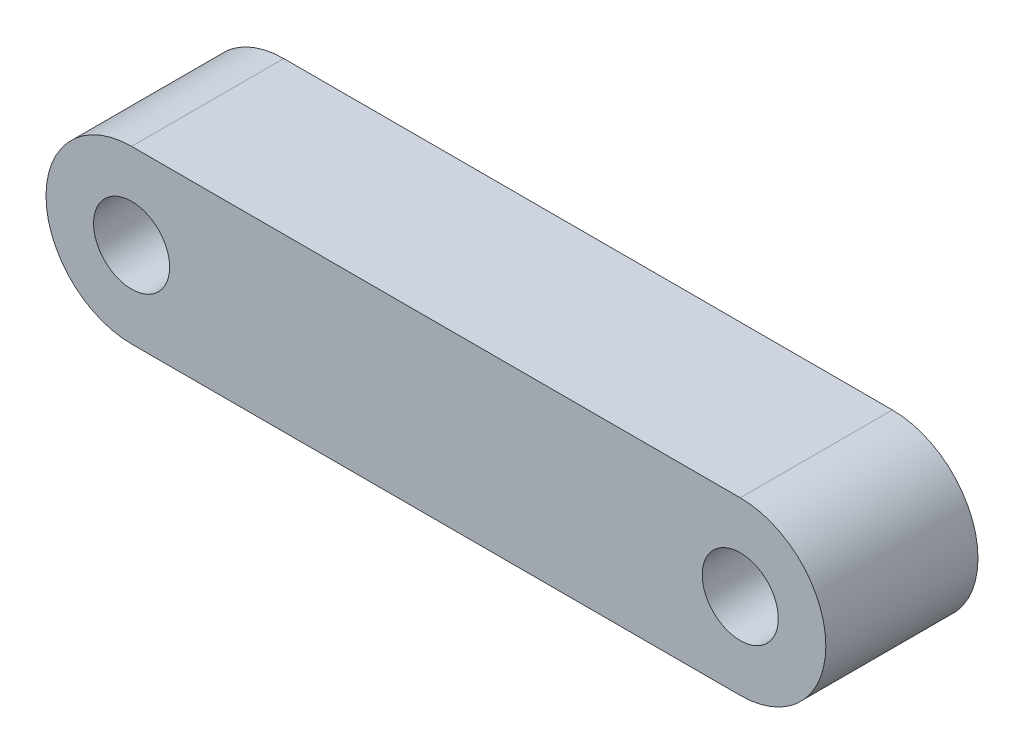
ISO-10303-21;
HEADER;
FILE_DESCRIPTION(('STEP AP214'),'2;1');
FILE_NAME('part.step','',(''),(''),'','','');
FILE_SCHEMA(('AUTOMOTIVE_DESIGN { 1 0 10303 214 1 1 1 1 }'));
ENDSEC;
DATA;
#1=APPLICATION_CONTEXT('core data for automotive mechanical design processes');
#2=APPLICATION_PROTOCOL_DEFINITION('international standard','automotive_design',2000,#1);
#3=PRODUCT_CONTEXT('',#1,'mechanical');
#4=PRODUCT('Part','Part','',(#3));
#5=PRODUCT_RELATED_PRODUCT_CATEGORY('part','',(#4));
#6=PRODUCT_DEFINITION_FORMATION('','',#4);
#7=PRODUCT_DEFINITION_CONTEXT('part definition',#1,'design');
#8=PRODUCT_DEFINITION('design','',#6,#7);
#9=PRODUCT_DEFINITION_SHAPE('','',#8);
#10=(LENGTH_UNIT() NAMED_UNIT(*) SI_UNIT(.MILLI.,.METRE.));
#11=(NAMED_UNIT(*) PLANE_ANGLE_UNIT() SI_UNIT($,.RADIAN.));
#12=(NAMED_UNIT(*) SI_UNIT($,.STERADIAN.) SOLID_ANGLE_UNIT());
#13=UNCERTAINTY_MEASURE_WITH_UNIT(LENGTH_MEASURE(1.E-05),#10,'distance_accuracy_value','');
#14=(GEOMETRIC_REPRESENTATION_CONTEXT(3) GLOBAL_UNCERTAINTY_ASSIGNED_CONTEXT((#13)) GLOBAL_UNIT_ASSIGNED_CONTEXT((#10,
#11,#12)) REPRESENTATION_CONTEXT('',''));
#15=CARTESIAN_POINT('',(0.,0.,0.));
#16=DIRECTION('',(0.,0.,1.));
#17=DIRECTION('',(1.,0.,0.));
#18=AXIS2_PLACEMENT_3D('',#15,#16,#17);
#19=CARTESIAN_POINT('',(0.,0.,8.));
#20=DIRECTION('',(0.,1.,0.));
#21=DIRECTION('',(0.,0.,1.));
#22=AXIS2_PLACEMENT_3D('',#19,#20,#21);
#23=PLANE('',#22);
#24=DIRECTION('',(1.,0.,0.));
#25=VECTOR('',#24,1.);
#26=CARTESIAN_POINT('',(0.,0.,0.));
#27=LINE('',#26,#25);
#28=CARTESIAN_POINT('',(0.,0.,0.));
#29=VERTEX_POINT('',#28);
#30=CARTESIAN_POINT('',(32.,0.,0.));
#31=VERTEX_POINT('',#30);
#32=EDGE_CURVE('E60',#29,#31,#27,.T.);
#33=ORIENTED_EDGE('',*,*,#32,.T.);
#34=DIRECTION('',(0.,0.,-1.));
#35=VECTOR('',#34,1.);
#36=CARTESIAN_POINT('',(32.,0.,8.));
#37=LINE('',#36,#35);
#38=CARTESIAN_POINT('',(32.,0.,8.));
#39=VERTEX_POINT('',#38);
#40=EDGE_CURVE('E41',#39,#31,#37,.T.);
#41=ORIENTED_EDGE('',*,*,#40,.F.);
#42=DIRECTION('',(1.,0.,0.));
#43=VECTOR('',#42,1.);
#44=CARTESIAN_POINT('',(0.,0.,8.));
#45=LINE('',#44,#43);
#46=CARTESIAN_POINT('',(0.,0.,8.));
#47=VERTEX_POINT('',#46);
#48=EDGE_CURVE('E72',#47,#39,#45,.T.);
#49=ORIENTED_EDGE('',*,*,#48,.F.);
#50=DIRECTION('',(0.,0.,-1.));
#51=VECTOR('',#50,1.);
#52=CARTESIAN_POINT('',(0.,0.,8.));
#53=LINE('',#52,#51);
#54=EDGE_CURVE('E11',#47,#29,#53,.T.);
#55=ORIENTED_EDGE('',*,*,#54,.T.);
#56=EDGE_LOOP('',(#33,#41,#49,#55));
#57=FACE_BOUND('',#56,.T.);
#58=ADVANCED_FACE('F33',(#57),#23,.F.);
#59=CARTESIAN_POINT('',(0.,9.,8.));
#60=DIRECTION('',(0.,-1.,0.));
#61=DIRECTION('',(0.,0.,-1.));
#62=AXIS2_PLACEMENT_3D('',#59,#60,#61);
#63=PLANE('',#62);
#64=DIRECTION('',(-1.,0.,0.));
#65=VECTOR('',#64,1.);
#66=CARTESIAN_POINT('',(0.,9.,0.));
#67=LINE('',#66,#65);
#68=CARTESIAN_POINT('',(32.,9.,0.));
#69=VERTEX_POINT('',#68);
#70=CARTESIAN_POINT('',(0.,9.,0.));
#71=VERTEX_POINT('',#70);
#72=EDGE_CURVE('E78',#69,#71,#67,.T.);
#73=ORIENTED_EDGE('',*,*,#72,.T.);
#74=DIRECTION('',(0.,0.,-1.));
#75=VECTOR('',#74,1.);
#76=CARTESIAN_POINT('',(0.,9.,8.));
#77=LINE('',#76,#75);
#78=CARTESIAN_POINT('',(0.,9.,8.));
#79=VERTEX_POINT('',#78);
#80=EDGE_CURVE('E101',#79,#71,#77,.T.);
#81=ORIENTED_EDGE('',*,*,#80,.F.);
#82=DIRECTION('',(-1.,0.,0.));
#83=VECTOR('',#82,1.);
#84=CARTESIAN_POINT('',(0.,9.,8.));
#85=LINE('',#84,#83);
#86=CARTESIAN_POINT('',(32.,9.,8.));
#87=VERTEX_POINT('',#86);
#88=EDGE_CURVE('E49',#87,#79,#85,.T.);
#89=ORIENTED_EDGE('',*,*,#88,.F.);
#90=DIRECTION('',(0.,0.,-1.));
#91=VECTOR('',#90,1.);
#92=CARTESIAN_POINT('',(32.,9.,8.));
#93=LINE('',#92,#91);
#94=EDGE_CURVE('E83',#87,#69,#93,.T.);
#95=ORIENTED_EDGE('',*,*,#94,.T.);
#96=EDGE_LOOP('',(#73,#81,#89,#95));
#97=FACE_BOUND('',#96,.T.);
#98=ADVANCED_FACE('F107',(#97),#63,.F.);
#99=CARTESIAN_POINT('',(0.,0.,8.));
#100=DIRECTION('',(0.,0.,-1.));
#101=DIRECTION('',(-1.,0.,0.));
#102=AXIS2_PLACEMENT_3D('',#99,#100,#101);
#103=PLANE('',#102);
#104=CARTESIAN_POINT('',(0.,4.5,8.));
#105=DIRECTION('',(0.,0.,1.));
#106=DIRECTION('',(1.,0.,0.));
#107=AXIS2_PLACEMENT_3D('',#104,#105,#106);
#108=CIRCLE('',#107,2.);
#109=CARTESIAN_POINT('',(2.,4.5,8.));
#110=VERTEX_POINT('',#109);
#111=EDGE_CURVE('E137',#110,#110,#108,.T.);
#112=ORIENTED_EDGE('',*,*,#111,.F.);
#113=EDGE_LOOP('',(#112));
#114=FACE_BOUND('',#113,.T.);
#115=CARTESIAN_POINT('',(32.,4.5,8.));
#116=DIRECTION('',(0.,0.,1.));
#117=DIRECTION('',(1.,0.,0.));
#118=AXIS2_PLACEMENT_3D('',#115,#116,#117);
#119=CIRCLE('',#118,2.);
#120=CARTESIAN_POINT('',(34.,4.5,8.));
#121=VERTEX_POINT('',#120);
#122=EDGE_CURVE('E92',#121,#121,#119,.T.);
#123=ORIENTED_EDGE('',*,*,#122,.F.);
#124=EDGE_LOOP('',(#123));
#125=FACE_BOUND('',#124,.T.);
#126=ORIENTED_EDGE('',*,*,#88,.T.);
#127=CARTESIAN_POINT('',(0.,4.5,8.));
#128=DIRECTION('',(0.,0.,1.));
#129=DIRECTION('',(1.,0.,0.));
#130=AXIS2_PLACEMENT_3D('',#127,#128,#129);
#131=CIRCLE('',#130,4.5);
#132=EDGE_CURVE('E77',#79,#47,#131,.T.);
#133=ORIENTED_EDGE('',*,*,#132,.T.);
#134=ORIENTED_EDGE('',*,*,#48,.T.);
#135=CARTESIAN_POINT('',(32.,4.5,8.));
#136=DIRECTION('',(0.,0.,1.));
#137=DIRECTION('',(-1.,0.,0.));
#138=AXIS2_PLACEMENT_3D('',#135,#136,#137);
#139=CIRCLE('',#138,4.5);
#140=EDGE_CURVE('E75',#39,#87,#139,.T.);
#141=ORIENTED_EDGE('',*,*,#140,.T.);
#142=EDGE_LOOP('',(#126,#133,#134,#141));
#143=FACE_BOUND('',#142,.T.);
#144=ADVANCED_FACE('F73',(#114,#125,#143),#103,.F.);
#145=CARTESIAN_POINT('',(0.,0.,0.));
#146=DIRECTION('',(0.,0.,-1.));
#147=DIRECTION('',(-1.,0.,0.));
#148=AXIS2_PLACEMENT_3D('',#145,#146,#147);
#149=PLANE('',#148);
#150=CARTESIAN_POINT('',(0.,4.5,0.));
#151=DIRECTION('',(0.,0.,1.));
#152=DIRECTION('',(1.,0.,0.));
#153=AXIS2_PLACEMENT_3D('',#150,#151,#152);
#154=CIRCLE('',#153,2.);
#155=CARTESIAN_POINT('',(2.,4.5,0.));
#156=VERTEX_POINT('',#155);
#157=EDGE_CURVE('E141',#156,#156,#154,.T.);
#158=ORIENTED_EDGE('',*,*,#157,.T.);
#159=EDGE_LOOP('',(#158));
#160=FACE_BOUND('',#159,.T.);
#161=CARTESIAN_POINT('',(32.,4.5,0.));
#162=DIRECTION('',(0.,0.,1.));
#163=DIRECTION('',(1.,0.,0.));
#164=AXIS2_PLACEMENT_3D('',#161,#162,#163);
#165=CIRCLE('',#164,2.);
#166=CARTESIAN_POINT('',(34.,4.5,0.));
#167=VERTEX_POINT('',#166);
#168=EDGE_CURVE('E88',#167,#167,#165,.T.);
#169=ORIENTED_EDGE('',*,*,#168,.T.);
#170=EDGE_LOOP('',(#169));
#171=FACE_BOUND('',#170,.T.);
#172=ORIENTED_EDGE('',*,*,#32,.F.);
#173=CARTESIAN_POINT('',(0.,4.5,0.));
#174=DIRECTION('',(0.,0.,1.));
#175=DIRECTION('',(1.,0.,0.));
#176=AXIS2_PLACEMENT_3D('',#173,#174,#175);
#177=CIRCLE('',#176,4.5);
#178=EDGE_CURVE('E96',#71,#29,#177,.T.);
#179=ORIENTED_EDGE('',*,*,#178,.F.);
#180=ORIENTED_EDGE('',*,*,#72,.F.);
#181=CARTESIAN_POINT('',(32.,4.5,0.));
#182=DIRECTION('',(0.,0.,1.));
#183=DIRECTION('',(-1.,0.,0.));
#184=AXIS2_PLACEMENT_3D('',#181,#182,#183);
#185=CIRCLE('',#184,4.5);
#186=EDGE_CURVE('E87',#31,#69,#185,.T.);
#187=ORIENTED_EDGE('',*,*,#186,.F.);
#188=EDGE_LOOP('',(#172,#179,#180,#187));
#189=FACE_BOUND('',#188,.T.);
#190=ADVANCED_FACE('F109',(#160,#171,#189),#149,.T.);
#191=CARTESIAN_POINT('',(0.,4.5,0.));
#192=DIRECTION('',(0.,0.,1.));
#193=DIRECTION('',(1.,0.,0.));
#194=AXIS2_PLACEMENT_3D('',#191,#192,#193);
#195=CYLINDRICAL_SURFACE('',#194,4.5);
#196=ORIENTED_EDGE('',*,*,#132,.F.);
#197=ORIENTED_EDGE('',*,*,#80,.T.);
#198=ORIENTED_EDGE('',*,*,#178,.T.);
#199=ORIENTED_EDGE('',*,*,#54,.F.);
#200=EDGE_LOOP('',(#196,#197,#198,#199));
#201=FACE_BOUND('',#200,.T.);
#202=ADVANCED_FACE('F112',(#201),#195,.T.);
#203=CARTESIAN_POINT('',(32.,4.5,0.));
#204=DIRECTION('',(0.,0.,1.));
#205=DIRECTION('',(1.,0.,0.));
#206=AXIS2_PLACEMENT_3D('',#203,#204,#205);
#207=CYLINDRICAL_SURFACE('',#206,4.5);
#208=ORIENTED_EDGE('',*,*,#140,.F.);
#209=ORIENTED_EDGE('',*,*,#40,.T.);
#210=ORIENTED_EDGE('',*,*,#186,.T.);
#211=ORIENTED_EDGE('',*,*,#94,.F.);
#212=EDGE_LOOP('',(#208,#209,#210,#211));
#213=FACE_BOUND('',#212,.T.);
#214=ADVANCED_FACE('F85',(#213),#207,.T.);
#215=CARTESIAN_POINT('',(32.,4.5,0.));
#216=DIRECTION('',(0.,0.,1.));
#217=DIRECTION('',(1.,0.,0.));
#218=AXIS2_PLACEMENT_3D('',#215,#216,#217);
#219=CYLINDRICAL_SURFACE('',#218,2.);
#220=ORIENTED_EDGE('',*,*,#168,.F.);
#221=EDGE_LOOP('',(#220));
#222=FACE_BOUND('',#221,.T.);
#223=ORIENTED_EDGE('',*,*,#122,.T.);
#224=EDGE_LOOP('',(#223));
#225=FACE_BOUND('',#224,.T.);
#226=ADVANCED_FACE('F119',(#222,#225),#219,.F.);
#227=CARTESIAN_POINT('',(0.,4.5,0.));
#228=DIRECTION('',(0.,0.,1.));
#229=DIRECTION('',(1.,0.,0.));
#230=AXIS2_PLACEMENT_3D('',#227,#228,#229);
#231=CYLINDRICAL_SURFACE('',#230,2.);
#232=ORIENTED_EDGE('',*,*,#157,.F.);
#233=EDGE_LOOP('',(#232));
#234=FACE_BOUND('',#233,.T.);
#235=ORIENTED_EDGE('',*,*,#111,.T.);
#236=EDGE_LOOP('',(#235));
#237=FACE_BOUND('',#236,.T.);
#238=ADVANCED_FACE('F146',(#234,#237),#231,.F.);
#239=CLOSED_SHELL('',(#58,#98,#144,#190,#202,#214,#226,#238));
#240=MANIFOLD_SOLID_BREP('B2',#239);
#241=ADVANCED_BREP_SHAPE_REPRESENTATION('',(#18,#240),#14);
#242=SHAPE_DEFINITION_REPRESENTATION(#9,#241);
ENDSEC;
END-ISO-10303-21;
